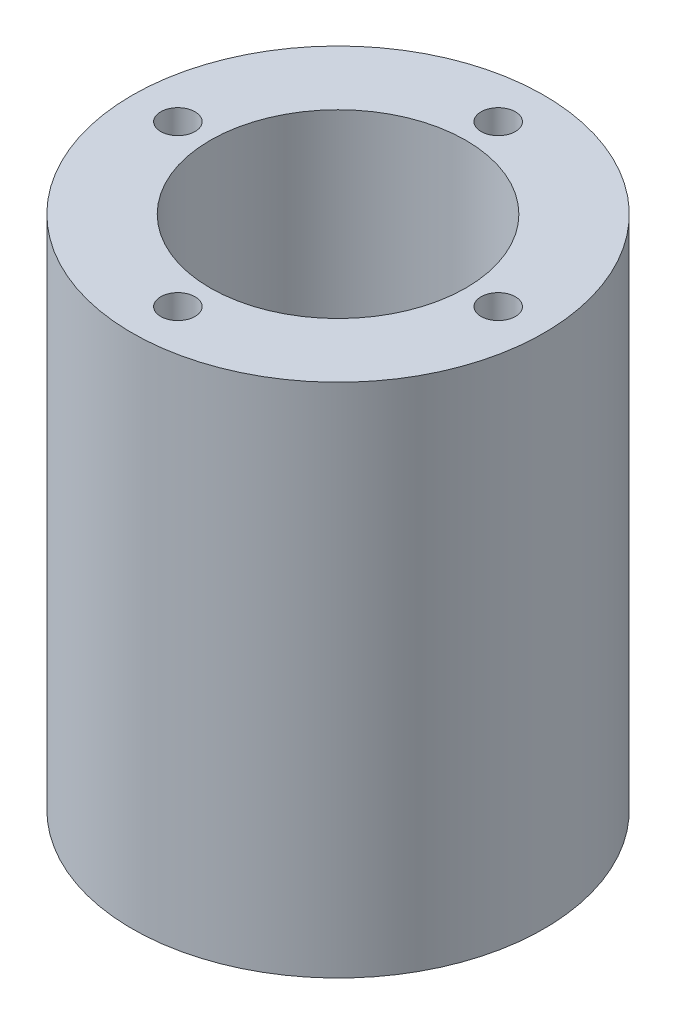
ISO-10303-21;
HEADER;
FILE_DESCRIPTION(('STEP AP214'),'2;1');
FILE_NAME('part.step','',(''),(''),'','','');
FILE_SCHEMA(('AUTOMOTIVE_DESIGN { 1 0 10303 214 1 1 1 1 }'));
ENDSEC;
DATA;
#1=APPLICATION_CONTEXT('core data for automotive mechanical design processes');
#2=APPLICATION_PROTOCOL_DEFINITION('international standard','automotive_design',2000,#1);
#3=PRODUCT_CONTEXT('',#1,'mechanical');
#4=PRODUCT('Part','Part','',(#3));
#5=PRODUCT_RELATED_PRODUCT_CATEGORY('part','',(#4));
#6=PRODUCT_DEFINITION_FORMATION('','',#4);
#7=PRODUCT_DEFINITION_CONTEXT('part definition',#1,'design');
#8=PRODUCT_DEFINITION('design','',#6,#7);
#9=PRODUCT_DEFINITION_SHAPE('','',#8);
#10=(LENGTH_UNIT() NAMED_UNIT(*) SI_UNIT(.MILLI.,.METRE.));
#11=(NAMED_UNIT(*) PLANE_ANGLE_UNIT() SI_UNIT($,.RADIAN.));
#12=(NAMED_UNIT(*) SI_UNIT($,.STERADIAN.) SOLID_ANGLE_UNIT());
#13=UNCERTAINTY_MEASURE_WITH_UNIT(LENGTH_MEASURE(1.E-05),#10,'distance_accuracy_value','');
#14=(GEOMETRIC_REPRESENTATION_CONTEXT(3) GLOBAL_UNCERTAINTY_ASSIGNED_CONTEXT((#13)) GLOBAL_UNIT_ASSIGNED_CONTEXT((#10,
#11,#12)) REPRESENTATION_CONTEXT('',''));
#15=CARTESIAN_POINT('',(0.,0.,0.));
#16=DIRECTION('',(0.,0.,1.));
#17=DIRECTION('',(1.,0.,0.));
#18=AXIS2_PLACEMENT_3D('',#15,#16,#17);
#19=CARTESIAN_POINT('',(0.,0.,0.));
#20=DIRECTION('',(0.,1.,0.));
#21=DIRECTION('',(1.,0.,0.));
#22=AXIS2_PLACEMENT_3D('',#19,#20,#21);
#23=PLANE('',#22);
#24=CARTESIAN_POINT('',(0.,0.,0.));
#25=DIRECTION('',(0.,1.,0.));
#26=DIRECTION('',(-1.,0.,0.));
#27=AXIS2_PLACEMENT_3D('',#24,#25,#26);
#28=CIRCLE('',#27,11.1779659969437);
#29=CARTESIAN_POINT('',(11.1779659969437,0.,0.));
#30=VERTEX_POINT('',#29);
#31=EDGE_CURVE('E102',#30,#30,#28,.T.);
#32=ORIENTED_EDGE('',*,*,#31,.T.);
#33=EDGE_LOOP('',(#32));
#34=FACE_BOUND('',#33,.T.);
#35=CARTESIAN_POINT('',(0.,0.,0.));
#36=DIRECTION('',(0.,1.,0.));
#37=DIRECTION('',(1.,0.,0.));
#38=AXIS2_PLACEMENT_3D('',#35,#36,#37);
#39=CIRCLE('',#38,18.);
#40=CARTESIAN_POINT('',(-18.,0.,0.));
#41=VERTEX_POINT('',#40);
#42=EDGE_CURVE('E11',#41,#41,#39,.T.);
#43=ORIENTED_EDGE('',*,*,#42,.F.);
#44=EDGE_LOOP('',(#43));
#45=FACE_BOUND('',#44,.T.);
#46=ADVANCED_FACE('F17',(#34,#45),#23,.F.);
#47=CARTESIAN_POINT('',(0.,45.1,0.));
#48=DIRECTION('',(0.,1.,0.));
#49=DIRECTION('',(1.,0.,0.));
#50=AXIS2_PLACEMENT_3D('',#47,#48,#49);
#51=PLANE('',#50);
#52=CARTESIAN_POINT('',(0.,45.1,14.));
#53=DIRECTION('',(0.,-1.,0.));
#54=DIRECTION('',(-1.,0.,0.));
#55=AXIS2_PLACEMENT_3D('',#52,#53,#54);
#56=CIRCLE('',#55,1.5);
#57=CARTESIAN_POINT('',(1.5,45.1,14.));
#58=VERTEX_POINT('',#57);
#59=EDGE_CURVE('E127',#58,#58,#56,.T.);
#60=ORIENTED_EDGE('',*,*,#59,.T.);
#61=EDGE_LOOP('',(#60));
#62=FACE_BOUND('',#61,.T.);
#63=CARTESIAN_POINT('',(0.,45.1,-14.));
#64=DIRECTION('',(0.,-1.,0.));
#65=DIRECTION('',(-1.,0.,0.));
#66=AXIS2_PLACEMENT_3D('',#63,#64,#65);
#67=CIRCLE('',#66,1.5);
#68=CARTESIAN_POINT('',(1.5,45.1,-14.));
#69=VERTEX_POINT('',#68);
#70=EDGE_CURVE('E85',#69,#69,#67,.T.);
#71=ORIENTED_EDGE('',*,*,#70,.T.);
#72=EDGE_LOOP('',(#71));
#73=FACE_BOUND('',#72,.T.);
#74=CARTESIAN_POINT('',(-14.,45.1,0.));
#75=DIRECTION('',(0.,-1.,0.));
#76=DIRECTION('',(-1.,0.,0.));
#77=AXIS2_PLACEMENT_3D('',#74,#75,#76);
#78=CIRCLE('',#77,1.5);
#79=CARTESIAN_POINT('',(-12.5,45.1,0.));
#80=VERTEX_POINT('',#79);
#81=EDGE_CURVE('E110',#80,#80,#78,.T.);
#82=ORIENTED_EDGE('',*,*,#81,.T.);
#83=EDGE_LOOP('',(#82));
#84=FACE_BOUND('',#83,.T.);
#85=CARTESIAN_POINT('',(14.,45.1,0.));
#86=DIRECTION('',(0.,-1.,0.));
#87=DIRECTION('',(-1.,0.,0.));
#88=AXIS2_PLACEMENT_3D('',#85,#86,#87);
#89=CIRCLE('',#88,1.5);
#90=CARTESIAN_POINT('',(15.5,45.1,0.));
#91=VERTEX_POINT('',#90);
#92=EDGE_CURVE('E104',#91,#91,#89,.T.);
#93=ORIENTED_EDGE('',*,*,#92,.T.);
#94=EDGE_LOOP('',(#93));
#95=FACE_BOUND('',#94,.T.);
#96=CARTESIAN_POINT('',(0.,45.1,0.));
#97=DIRECTION('',(0.,-1.,0.));
#98=DIRECTION('',(-1.,0.,0.));
#99=AXIS2_PLACEMENT_3D('',#96,#97,#98);
#100=CIRCLE('',#99,11.1779659969437);
#101=CARTESIAN_POINT('',(11.1779659969437,45.1,0.));
#102=VERTEX_POINT('',#101);
#103=EDGE_CURVE('E115',#102,#102,#100,.T.);
#104=ORIENTED_EDGE('',*,*,#103,.T.);
#105=EDGE_LOOP('',(#104));
#106=FACE_BOUND('',#105,.T.);
#107=CARTESIAN_POINT('',(0.,45.1,0.));
#108=DIRECTION('',(0.,1.,0.));
#109=DIRECTION('',(1.,0.,0.));
#110=AXIS2_PLACEMENT_3D('',#107,#108,#109);
#111=CIRCLE('',#110,18.);
#112=CARTESIAN_POINT('',(-18.,45.1,0.));
#113=VERTEX_POINT('',#112);
#114=EDGE_CURVE('E133',#113,#113,#111,.T.);
#115=ORIENTED_EDGE('',*,*,#114,.T.);
#116=EDGE_LOOP('',(#115));
#117=FACE_BOUND('',#116,.T.);
#118=ADVANCED_FACE('F19',(#62,#73,#84,#95,#106,#117),#51,.T.);
#119=CARTESIAN_POINT('',(0.,0.,0.));
#120=DIRECTION('',(0.,1.,0.));
#121=DIRECTION('',(1.,0.,0.));
#122=AXIS2_PLACEMENT_3D('',#119,#120,#121);
#123=CYLINDRICAL_SURFACE('',#122,18.);
#124=ORIENTED_EDGE('',*,*,#114,.F.);
#125=DIRECTION('',(0.,-1.,0.));
#126=VECTOR('',#125,1.);
#127=CARTESIAN_POINT('',(-18.,0.,0.));
#128=LINE('',#127,#126);
#129=EDGE_CURVE('E21',#113,#41,#128,.T.);
#130=ORIENTED_EDGE('',*,*,#129,.T.);
#131=ORIENTED_EDGE('',*,*,#42,.T.);
#132=ORIENTED_EDGE('',*,*,#129,.F.);
#133=EDGE_LOOP('',(#124,#130,#131,#132));
#134=FACE_BOUND('',#133,.T.);
#135=ADVANCED_FACE('F175',(#134),#123,.T.);
#136=CARTESIAN_POINT('',(0.,21.5542,14.));
#137=DIRECTION('',(0.,1.,0.));
#138=DIRECTION('',(1.,0.,0.));
#139=AXIS2_PLACEMENT_3D('',#136,#137,#138);
#140=PLANE('',#139);
#141=CARTESIAN_POINT('',(0.,21.5542,14.));
#142=DIRECTION('',(0.,-1.,0.));
#143=DIRECTION('',(-1.,0.,0.));
#144=AXIS2_PLACEMENT_3D('',#141,#142,#143);
#145=CIRCLE('',#144,1.5);
#146=CARTESIAN_POINT('',(1.5,21.5542,14.));
#147=VERTEX_POINT('',#146);
#148=EDGE_CURVE('E126',#147,#147,#145,.T.);
#149=ORIENTED_EDGE('',*,*,#148,.F.);
#150=EDGE_LOOP('',(#149));
#151=FACE_BOUND('',#150,.T.);
#152=ADVANCED_FACE('F189',(#151),#140,.T.);
#153=CARTESIAN_POINT('',(0.,53.228,14.));
#154=DIRECTION('',(0.,-1.,0.));
#155=DIRECTION('',(-1.,0.,0.));
#156=AXIS2_PLACEMENT_3D('',#153,#154,#155);
#157=CYLINDRICAL_SURFACE('',#156,1.5);
#158=ORIENTED_EDGE('',*,*,#59,.F.);
#159=DIRECTION('',(0.,-1.,0.));
#160=VECTOR('',#159,1.);
#161=CARTESIAN_POINT('',(1.5,53.228,14.));
#162=LINE('',#161,#160);
#163=EDGE_CURVE('E122',#58,#147,#162,.T.);
#164=ORIENTED_EDGE('',*,*,#163,.T.);
#165=ORIENTED_EDGE('',*,*,#148,.T.);
#166=ORIENTED_EDGE('',*,*,#163,.F.);
#167=EDGE_LOOP('',(#158,#164,#165,#166));
#168=FACE_BOUND('',#167,.T.);
#169=ADVANCED_FACE('F187',(#168),#157,.F.);
#170=CARTESIAN_POINT('',(0.,21.5542,-14.));
#171=DIRECTION('',(0.,1.,0.));
#172=DIRECTION('',(1.,0.,0.));
#173=AXIS2_PLACEMENT_3D('',#170,#171,#172);
#174=PLANE('',#173);
#175=CARTESIAN_POINT('',(0.,21.5542,-14.));
#176=DIRECTION('',(0.,-1.,0.));
#177=DIRECTION('',(-1.,0.,0.));
#178=AXIS2_PLACEMENT_3D('',#175,#176,#177);
#179=CIRCLE('',#178,1.5);
#180=CARTESIAN_POINT('',(1.5,21.5542,-14.));
#181=VERTEX_POINT('',#180);
#182=EDGE_CURVE('E87',#181,#181,#179,.T.);
#183=ORIENTED_EDGE('',*,*,#182,.F.);
#184=EDGE_LOOP('',(#183));
#185=FACE_BOUND('',#184,.T.);
#186=ADVANCED_FACE('F180',(#185),#174,.T.);
#187=CARTESIAN_POINT('',(0.,53.228,-14.));
#188=DIRECTION('',(0.,-1.,0.));
#189=DIRECTION('',(-1.,0.,0.));
#190=AXIS2_PLACEMENT_3D('',#187,#188,#189);
#191=CYLINDRICAL_SURFACE('',#190,1.5);
#192=ORIENTED_EDGE('',*,*,#70,.F.);
#193=DIRECTION('',(0.,-1.,0.));
#194=VECTOR('',#193,1.);
#195=CARTESIAN_POINT('',(1.5,53.228,-14.));
#196=LINE('',#195,#194);
#197=EDGE_CURVE('E82',#69,#181,#196,.T.);
#198=ORIENTED_EDGE('',*,*,#197,.T.);
#199=ORIENTED_EDGE('',*,*,#182,.T.);
#200=ORIENTED_EDGE('',*,*,#197,.F.);
#201=EDGE_LOOP('',(#192,#198,#199,#200));
#202=FACE_BOUND('',#201,.T.);
#203=ADVANCED_FACE('F84',(#202),#191,.F.);
#204=CARTESIAN_POINT('',(-14.,21.5542,0.));
#205=DIRECTION('',(0.,1.,0.));
#206=DIRECTION('',(1.,0.,0.));
#207=AXIS2_PLACEMENT_3D('',#204,#205,#206);
#208=PLANE('',#207);
#209=CARTESIAN_POINT('',(-14.,21.5542,0.));
#210=DIRECTION('',(0.,-1.,0.));
#211=DIRECTION('',(-1.,0.,0.));
#212=AXIS2_PLACEMENT_3D('',#209,#210,#211);
#213=CIRCLE('',#212,1.5);
#214=CARTESIAN_POINT('',(-12.5,21.5542,0.));
#215=VERTEX_POINT('',#214);
#216=EDGE_CURVE('E93',#215,#215,#213,.T.);
#217=ORIENTED_EDGE('',*,*,#216,.F.);
#218=EDGE_LOOP('',(#217));
#219=FACE_BOUND('',#218,.T.);
#220=ADVANCED_FACE('F165',(#219),#208,.T.);
#221=CARTESIAN_POINT('',(-14.,53.228,0.));
#222=DIRECTION('',(0.,-1.,0.));
#223=DIRECTION('',(-1.,0.,0.));
#224=AXIS2_PLACEMENT_3D('',#221,#222,#223);
#225=CYLINDRICAL_SURFACE('',#224,1.5);
#226=ORIENTED_EDGE('',*,*,#81,.F.);
#227=DIRECTION('',(0.,-1.,0.));
#228=VECTOR('',#227,1.);
#229=CARTESIAN_POINT('',(-12.5,53.228,0.));
#230=LINE('',#229,#228);
#231=EDGE_CURVE('E99',#80,#215,#230,.T.);
#232=ORIENTED_EDGE('',*,*,#231,.T.);
#233=ORIENTED_EDGE('',*,*,#216,.T.);
#234=ORIENTED_EDGE('',*,*,#231,.F.);
#235=EDGE_LOOP('',(#226,#232,#233,#234));
#236=FACE_BOUND('',#235,.T.);
#237=ADVANCED_FACE('F157',(#236),#225,.F.);
#238=CARTESIAN_POINT('',(14.,21.5542,0.));
#239=DIRECTION('',(0.,1.,0.));
#240=DIRECTION('',(1.,0.,0.));
#241=AXIS2_PLACEMENT_3D('',#238,#239,#240);
#242=PLANE('',#241);
#243=CARTESIAN_POINT('',(14.,21.5542,0.));
#244=DIRECTION('',(0.,-1.,0.));
#245=DIRECTION('',(-1.,0.,0.));
#246=AXIS2_PLACEMENT_3D('',#243,#244,#245);
#247=CIRCLE('',#246,1.5);
#248=CARTESIAN_POINT('',(15.5,21.5542,0.));
#249=VERTEX_POINT('',#248);
#250=EDGE_CURVE('E107',#249,#249,#247,.T.);
#251=ORIENTED_EDGE('',*,*,#250,.F.);
#252=EDGE_LOOP('',(#251));
#253=FACE_BOUND('',#252,.T.);
#254=ADVANCED_FACE('F155',(#253),#242,.T.);
#255=CARTESIAN_POINT('',(14.,53.228,0.));
#256=DIRECTION('',(0.,-1.,0.));
#257=DIRECTION('',(-1.,0.,0.));
#258=AXIS2_PLACEMENT_3D('',#255,#256,#257);
#259=CYLINDRICAL_SURFACE('',#258,1.5);
#260=ORIENTED_EDGE('',*,*,#92,.F.);
#261=DIRECTION('',(0.,-1.,0.));
#262=VECTOR('',#261,1.);
#263=CARTESIAN_POINT('',(15.5,53.228,0.));
#264=LINE('',#263,#262);
#265=EDGE_CURVE('E111',#91,#249,#264,.T.);
#266=ORIENTED_EDGE('',*,*,#265,.T.);
#267=ORIENTED_EDGE('',*,*,#250,.T.);
#268=ORIENTED_EDGE('',*,*,#265,.F.);
#269=EDGE_LOOP('',(#260,#266,#267,#268));
#270=FACE_BOUND('',#269,.T.);
#271=ADVANCED_FACE('F152',(#270),#259,.F.);
#272=CARTESIAN_POINT('',(0.,45.1,0.));
#273=DIRECTION('',(0.,-1.,0.));
#274=DIRECTION('',(-1.,0.,0.));
#275=AXIS2_PLACEMENT_3D('',#272,#273,#274);
#276=CYLINDRICAL_SURFACE('',#275,11.1779659969437);
#277=ORIENTED_EDGE('',*,*,#103,.F.);
#278=DIRECTION('',(0.,-1.,0.));
#279=VECTOR('',#278,1.);
#280=CARTESIAN_POINT('',(11.1779659969437,45.1,0.));
#281=LINE('',#280,#279);
#282=EDGE_CURVE('E105',#102,#30,#281,.T.);
#283=ORIENTED_EDGE('',*,*,#282,.T.);
#284=ORIENTED_EDGE('',*,*,#31,.F.);
#285=ORIENTED_EDGE('',*,*,#282,.F.);
#286=EDGE_LOOP('',(#277,#283,#284,#285));
#287=FACE_BOUND('',#286,.T.);
#288=ADVANCED_FACE('F163',(#287),#276,.F.);
#289=CLOSED_SHELL('',(#46,#118,#135,#152,#169,#186,#203,#220,#237,#254,#271,#288));
#290=MANIFOLD_SOLID_BREP('B1',#289);
#291=ADVANCED_BREP_SHAPE_REPRESENTATION('',(#18,#290),#14);
#292=SHAPE_DEFINITION_REPRESENTATION(#9,#291);
ENDSEC;
END-ISO-10303-21;
